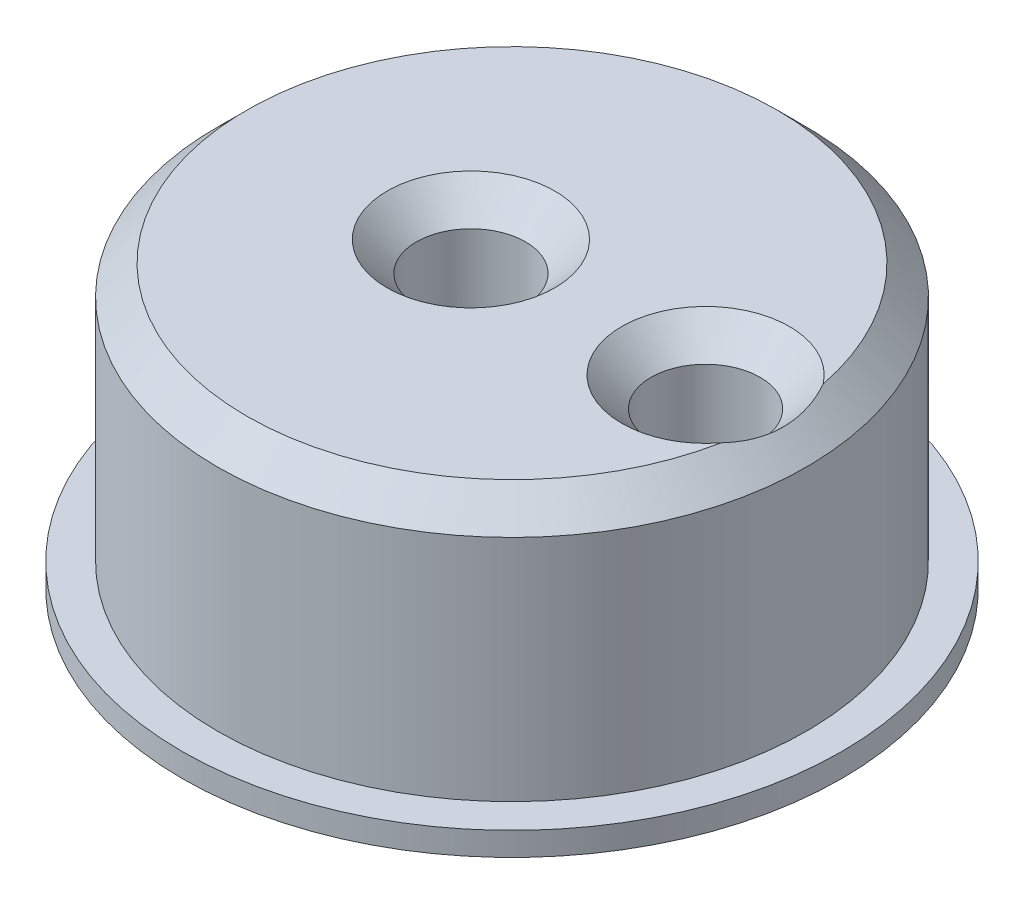
ISO-10303-21;
HEADER;
FILE_DESCRIPTION(('STEP AP214'),'2;1');
FILE_NAME('part.step','',(''),(''),'','','');
FILE_SCHEMA(('AUTOMOTIVE_DESIGN { 1 0 10303 214 1 1 1 1 }'));
ENDSEC;
DATA;
#1=APPLICATION_CONTEXT('core data for automotive mechanical design processes');
#2=APPLICATION_PROTOCOL_DEFINITION('international standard','automotive_design',2000,#1);
#3=PRODUCT_CONTEXT('',#1,'mechanical');
#4=PRODUCT('Part','Part','',(#3));
#5=PRODUCT_RELATED_PRODUCT_CATEGORY('part','',(#4));
#6=PRODUCT_DEFINITION_FORMATION('','',#4);
#7=PRODUCT_DEFINITION_CONTEXT('part definition',#1,'design');
#8=PRODUCT_DEFINITION('design','',#6,#7);
#9=PRODUCT_DEFINITION_SHAPE('','',#8);
#10=(LENGTH_UNIT() NAMED_UNIT(*) SI_UNIT(.MILLI.,.METRE.));
#11=(NAMED_UNIT(*) PLANE_ANGLE_UNIT() SI_UNIT($,.RADIAN.));
#12=(NAMED_UNIT(*) SI_UNIT($,.STERADIAN.) SOLID_ANGLE_UNIT());
#13=UNCERTAINTY_MEASURE_WITH_UNIT(LENGTH_MEASURE(1.E-05),#10,'distance_accuracy_value','');
#14=(GEOMETRIC_REPRESENTATION_CONTEXT(3) GLOBAL_UNCERTAINTY_ASSIGNED_CONTEXT((#13)) GLOBAL_UNIT_ASSIGNED_CONTEXT((#10,
#11,#12)) REPRESENTATION_CONTEXT('',''));
#15=CARTESIAN_POINT('',(0.,0.,0.));
#16=DIRECTION('',(0.,0.,1.));
#17=DIRECTION('',(1.,0.,0.));
#18=AXIS2_PLACEMENT_3D('',#15,#16,#17);
#19=CARTESIAN_POINT('',(0.,4.4,0.));
#20=DIRECTION('',(0.,1.,0.));
#21=DIRECTION('',(0.,0.,1.));
#22=AXIS2_PLACEMENT_3D('',#19,#20,#21);
#23=PLANE('',#22);
#24=CARTESIAN_POINT('',(-0.7,4.4,0.));
#25=DIRECTION('',(0.,1.,0.));
#26=DIRECTION('',(0.,0.,1.));
#27=AXIS2_PLACEMENT_3D('',#24,#25,#26);
#28=CIRCLE('',#27,1.43000000000001);
#29=CARTESIAN_POINT('',(-0.7,4.4,1.43000000000001));
#30=VERTEX_POINT('',#29);
#31=EDGE_CURVE('E52',#30,#30,#28,.F.);
#32=ORIENTED_EDGE('',*,*,#31,.T.);
#33=EDGE_LOOP('',(#32));
#34=FACE_BOUND('',#33,.T.);
#35=CARTESIAN_POINT('',(3.3,4.4,0.));
#36=DIRECTION('',(0.,1.,0.));
#37=DIRECTION('',(0.,0.,1.));
#38=AXIS2_PLACEMENT_3D('',#35,#36,#37);
#39=CIRCLE('',#38,1.43000000000001);
#40=CARTESIAN_POINT('',(3.3,4.4,1.43000000000001));
#41=VERTEX_POINT('',#40);
#42=CARTESIAN_POINT('',(4.43568181818182,4.4,-0.868980326504148));
#43=VERTEX_POINT('',#42);
#44=EDGE_CURVE('E71',#41,#43,#39,.F.);
#45=ORIENTED_EDGE('',*,*,#44,.T.);
#46=CARTESIAN_POINT('',(0.,4.4,0.));
#47=DIRECTION('',(0.,1.,0.));
#48=DIRECTION('',(0.,0.,1.));
#49=AXIS2_PLACEMENT_3D('',#46,#47,#48);
#50=CIRCLE('',#49,4.52);
#51=CARTESIAN_POINT('',(0.,4.4,4.52));
#52=VERTEX_POINT('',#51);
#53=EDGE_CURVE('E84',#43,#52,#50,.T.);
#54=ORIENTED_EDGE('',*,*,#53,.T.);
#55=CARTESIAN_POINT('',(0.,4.4,0.));
#56=DIRECTION('',(0.,1.,0.));
#57=DIRECTION('',(0.,0.,1.));
#58=AXIS2_PLACEMENT_3D('',#55,#56,#57);
#59=CIRCLE('',#58,4.52);
#60=CARTESIAN_POINT('',(4.43568181818182,4.4,0.868980326504148));
#61=VERTEX_POINT('',#60);
#62=EDGE_CURVE('E59',#52,#61,#59,.T.);
#63=ORIENTED_EDGE('',*,*,#62,.T.);
#64=CARTESIAN_POINT('',(3.3,4.4,0.));
#65=DIRECTION('',(0.,1.,0.));
#66=DIRECTION('',(0.,0.,1.));
#67=AXIS2_PLACEMENT_3D('',#64,#65,#66);
#68=CIRCLE('',#67,1.43000000000001);
#69=EDGE_CURVE('E69',#61,#41,#68,.F.);
#70=ORIENTED_EDGE('',*,*,#69,.T.);
#71=EDGE_LOOP('',(#45,#54,#63,#70));
#72=FACE_BOUND('',#71,.T.);
#73=ADVANCED_FACE('F37',(#34,#72),#23,.T.);
#74=CARTESIAN_POINT('',(0.,4.4,0.));
#75=DIRECTION('',(0.,-1.,0.));
#76=DIRECTION('',(0.,0.,-1.));
#77=AXIS2_PLACEMENT_3D('',#74,#75,#76);
#78=CYLINDRICAL_SURFACE('',#77,5.02);
#79=CARTESIAN_POINT('',(0.,3.9,0.));
#80=DIRECTION('',(0.,1.,0.));
#81=DIRECTION('',(0.,0.,1.));
#82=AXIS2_PLACEMENT_3D('',#79,#80,#81);
#83=CIRCLE('',#82,5.02);
#84=CARTESIAN_POINT('',(0.,3.9,5.02));
#85=VERTEX_POINT('',#84);
#86=EDGE_CURVE('E11',#85,#85,#83,.F.);
#87=ORIENTED_EDGE('',*,*,#86,.T.);
#88=EDGE_LOOP('',(#87));
#89=FACE_BOUND('',#88,.T.);
#90=CARTESIAN_POINT('',(0.,0.,0.));
#91=DIRECTION('',(0.,1.,0.));
#92=DIRECTION('',(0.,0.,1.));
#93=AXIS2_PLACEMENT_3D('',#90,#91,#92);
#94=CIRCLE('',#93,5.02);
#95=CARTESIAN_POINT('',(0.,0.,5.02));
#96=VERTEX_POINT('',#95);
#97=EDGE_CURVE('E111',#96,#96,#94,.T.);
#98=ORIENTED_EDGE('',*,*,#97,.T.);
#99=EDGE_LOOP('',(#98));
#100=FACE_BOUND('',#99,.T.);
#101=ADVANCED_FACE('F142',(#89,#100),#78,.T.);
#102=CARTESIAN_POINT('',(3.3,4.4,0.));
#103=DIRECTION('',(0.,-1.,0.));
#104=DIRECTION('',(0.,0.,-1.));
#105=AXIS2_PLACEMENT_3D('',#102,#103,#104);
#106=CYLINDRICAL_SURFACE('',#105,0.930000000000002);
#107=CARTESIAN_POINT('',(3.3,0.1,0.));
#108=DIRECTION('',(0.,-1.,0.));
#109=DIRECTION('',(0.,0.,-1.));
#110=AXIS2_PLACEMENT_3D('',#107,#108,#109);
#111=CIRCLE('',#110,0.930000000000002);
#112=CARTESIAN_POINT('',(3.3,0.1,-0.930000000000002));
#113=VERTEX_POINT('',#112);
#114=EDGE_CURVE('E105',#113,#113,#111,.T.);
#115=ORIENTED_EDGE('',*,*,#114,.T.);
#116=EDGE_LOOP('',(#115));
#117=FACE_BOUND('',#116,.T.);
#118=CARTESIAN_POINT('',(3.3,3.9,0.));
#119=DIRECTION('',(0.,1.,0.));
#120=DIRECTION('',(0.,0.,1.));
#121=AXIS2_PLACEMENT_3D('',#118,#119,#120);
#122=CIRCLE('',#121,0.930000000000002);
#123=CARTESIAN_POINT('',(3.3,3.9,0.930000000000002));
#124=VERTEX_POINT('',#123);
#125=EDGE_CURVE('E108',#124,#124,#122,.T.);
#126=ORIENTED_EDGE('',*,*,#125,.T.);
#127=EDGE_LOOP('',(#126));
#128=FACE_BOUND('',#127,.T.);
#129=ADVANCED_FACE('F147',(#117,#128),#106,.F.);
#130=CARTESIAN_POINT('',(-0.7,4.4,0.));
#131=DIRECTION('',(0.,-1.,0.));
#132=DIRECTION('',(0.,0.,-1.));
#133=AXIS2_PLACEMENT_3D('',#130,#131,#132);
#134=CYLINDRICAL_SURFACE('',#133,0.93);
#135=CARTESIAN_POINT('',(-0.7,0.100000000000002,0.));
#136=DIRECTION('',(0.,-1.,0.));
#137=DIRECTION('',(0.,0.,-1.));
#138=AXIS2_PLACEMENT_3D('',#135,#136,#137);
#139=CIRCLE('',#138,0.93);
#140=CARTESIAN_POINT('',(-0.7,0.100000000000002,-0.93));
#141=VERTEX_POINT('',#140);
#142=EDGE_CURVE('E76',#141,#141,#139,.T.);
#143=ORIENTED_EDGE('',*,*,#142,.T.);
#144=EDGE_LOOP('',(#143));
#145=FACE_BOUND('',#144,.T.);
#146=CARTESIAN_POINT('',(-0.7,3.9,0.));
#147=DIRECTION('',(0.,1.,0.));
#148=DIRECTION('',(0.,0.,1.));
#149=AXIS2_PLACEMENT_3D('',#146,#147,#148);
#150=CIRCLE('',#149,0.93);
#151=CARTESIAN_POINT('',(-0.7,3.9,0.930000000000001));
#152=VERTEX_POINT('',#151);
#153=EDGE_CURVE('E79',#152,#152,#150,.T.);
#154=ORIENTED_EDGE('',*,*,#153,.T.);
#155=EDGE_LOOP('',(#154));
#156=FACE_BOUND('',#155,.T.);
#157=ADVANCED_FACE('F137',(#145,#156),#134,.F.);
#158=CARTESIAN_POINT('',(0.,-0.4,0.));
#159=DIRECTION('',(0.,-1.,0.));
#160=DIRECTION('',(0.,0.,-1.));
#161=AXIS2_PLACEMENT_3D('',#158,#159,#160);
#162=PLANE('',#161);
#163=CARTESIAN_POINT('',(3.3,-0.4,0.));
#164=DIRECTION('',(0.,-1.,0.));
#165=DIRECTION('',(0.,0.,-1.));
#166=AXIS2_PLACEMENT_3D('',#163,#164,#165);
#167=CIRCLE('',#166,1.43);
#168=CARTESIAN_POINT('',(3.3,-0.4,-1.43));
#169=VERTEX_POINT('',#168);
#170=EDGE_CURVE('E98',#169,#169,#167,.F.);
#171=ORIENTED_EDGE('',*,*,#170,.T.);
#172=EDGE_LOOP('',(#171));
#173=FACE_BOUND('',#172,.T.);
#174=CARTESIAN_POINT('',(-0.7,-0.4,0.));
#175=DIRECTION('',(0.,-1.,0.));
#176=DIRECTION('',(0.,0.,-1.));
#177=AXIS2_PLACEMENT_3D('',#174,#175,#176);
#178=CIRCLE('',#177,1.43);
#179=CARTESIAN_POINT('',(-0.7,-0.4,-1.43));
#180=VERTEX_POINT('',#179);
#181=EDGE_CURVE('E100',#180,#180,#178,.F.);
#182=ORIENTED_EDGE('',*,*,#181,.T.);
#183=EDGE_LOOP('',(#182));
#184=FACE_BOUND('',#183,.T.);
#185=CARTESIAN_POINT('',(0.,-0.4,0.));
#186=DIRECTION('',(0.,-1.,0.));
#187=DIRECTION('',(0.,0.,-1.));
#188=AXIS2_PLACEMENT_3D('',#185,#186,#187);
#189=CIRCLE('',#188,5.62);
#190=CARTESIAN_POINT('',(0.,-0.4,-5.62));
#191=VERTEX_POINT('',#190);
#192=EDGE_CURVE('E114',#191,#191,#189,.T.);
#193=ORIENTED_EDGE('',*,*,#192,.T.);
#194=EDGE_LOOP('',(#193));
#195=FACE_BOUND('',#194,.T.);
#196=ADVANCED_FACE('F121',(#173,#184,#195),#162,.T.);
#197=CARTESIAN_POINT('',(0.,0.,0.));
#198=DIRECTION('',(0.,-1.,0.));
#199=DIRECTION('',(0.,0.,-1.));
#200=AXIS2_PLACEMENT_3D('',#197,#198,#199);
#201=PLANE('',#200);
#202=ORIENTED_EDGE('',*,*,#97,.F.);
#203=EDGE_LOOP('',(#202));
#204=FACE_BOUND('',#203,.T.);
#205=CARTESIAN_POINT('',(0.,0.,0.));
#206=DIRECTION('',(0.,-1.,0.));
#207=DIRECTION('',(0.,0.,-1.));
#208=AXIS2_PLACEMENT_3D('',#205,#206,#207);
#209=CIRCLE('',#208,5.62);
#210=CARTESIAN_POINT('',(0.,0.,-5.62));
#211=VERTEX_POINT('',#210);
#212=EDGE_CURVE('E115',#211,#211,#209,.T.);
#213=ORIENTED_EDGE('',*,*,#212,.F.);
#214=EDGE_LOOP('',(#213));
#215=FACE_BOUND('',#214,.T.);
#216=ADVANCED_FACE('F127',(#204,#215),#201,.F.);
#217=CARTESIAN_POINT('',(0.,-0.4,0.));
#218=DIRECTION('',(0.,1.,0.));
#219=DIRECTION('',(0.,0.,1.));
#220=AXIS2_PLACEMENT_3D('',#217,#218,#219);
#221=CYLINDRICAL_SURFACE('',#220,5.62);
#222=ORIENTED_EDGE('',*,*,#192,.F.);
#223=EDGE_LOOP('',(#222));
#224=FACE_BOUND('',#223,.T.);
#225=ORIENTED_EDGE('',*,*,#212,.T.);
#226=EDGE_LOOP('',(#225));
#227=FACE_BOUND('',#226,.T.);
#228=ADVANCED_FACE('F123',(#224,#227),#221,.T.);
#229=CARTESIAN_POINT('',(3.3,0.1,0.));
#230=DIRECTION('',(0.,-1.,0.));
#231=DIRECTION('',(0.,0.,-1.));
#232=AXIS2_PLACEMENT_3D('',#229,#230,#231);
#233=CONICAL_SURFACE('',#232,0.930000000000002,0.785398163397449);
#234=ORIENTED_EDGE('',*,*,#170,.F.);
#235=EDGE_LOOP('',(#234));
#236=FACE_BOUND('',#235,.T.);
#237=ORIENTED_EDGE('',*,*,#114,.F.);
#238=EDGE_LOOP('',(#237));
#239=FACE_BOUND('',#238,.T.);
#240=ADVANCED_FACE('F126',(#236,#239),#233,.F.);
#241=CARTESIAN_POINT('',(-0.7,0.100000000000002,0.));
#242=DIRECTION('',(0.,-1.,0.));
#243=DIRECTION('',(0.,0.,-1.));
#244=AXIS2_PLACEMENT_3D('',#241,#242,#243);
#245=CONICAL_SURFACE('',#244,0.93,0.785398163397448);
#246=ORIENTED_EDGE('',*,*,#181,.F.);
#247=EDGE_LOOP('',(#246));
#248=FACE_BOUND('',#247,.T.);
#249=ORIENTED_EDGE('',*,*,#142,.F.);
#250=EDGE_LOOP('',(#249));
#251=FACE_BOUND('',#250,.T.);
#252=ADVANCED_FACE('F93',(#248,#251),#245,.F.);
#253=CARTESIAN_POINT('',(-0.7,3.9,0.));
#254=DIRECTION('',(0.,1.,0.));
#255=DIRECTION('',(0.,0.,1.));
#256=AXIS2_PLACEMENT_3D('',#253,#254,#255);
#257=CONICAL_SURFACE('',#256,0.93,0.78539816339745);
#258=ORIENTED_EDGE('',*,*,#31,.F.);
#259=EDGE_LOOP('',(#258));
#260=FACE_BOUND('',#259,.T.);
#261=ORIENTED_EDGE('',*,*,#153,.F.);
#262=EDGE_LOOP('',(#261));
#263=FACE_BOUND('',#262,.T.);
#264=ADVANCED_FACE('F90',(#260,#263),#257,.F.);
#265=CARTESIAN_POINT('',(3.3,3.9,0.));
#266=DIRECTION('',(0.,1.,0.));
#267=DIRECTION('',(0.,0.,1.));
#268=AXIS2_PLACEMENT_3D('',#265,#266,#267);
#269=CONICAL_SURFACE('',#268,0.930000000000002,0.78539816339745);
#270=ORIENTED_EDGE('',*,*,#125,.F.);
#271=EDGE_LOOP('',(#270));
#272=FACE_BOUND('',#271,.T.);
#273=CARTESIAN_POINT('',(4.43532121212121,4.4002,-0.8697803086456));
#274=CARTESIAN_POINT('',(4.45774347325075,4.38776412413458,-0.820084857761405));
#275=CARTESIAN_POINT('',(4.47842609060243,4.37629309266614,-0.769345092409477));
#276=CARTESIAN_POINT('',(4.51603207682698,4.35543599103895,-0.666036860501678));
#277=CARTESIAN_POINT('',(4.53295281328495,4.34605138087499,-0.613467142983447));
#278=CARTESIAN_POINT('',(4.56269129751347,4.32955776775784,-0.506942560419511));
#279=CARTESIAN_POINT('',(4.57551770022107,4.32244396458737,-0.452990881183548));
#280=CARTESIAN_POINT('',(4.59688127230878,4.31059526073689,-0.344018398168748));
#281=CARTESIAN_POINT('',(4.60541968343436,4.30585967135771,-0.288997908702622));
#282=CARTESIAN_POINT('',(4.62404259742138,4.29553099641711,-0.125370359791001));
#283=CARTESIAN_POINT('',(4.62782788724165,4.29343159212342,-0.0157280341275598));
#284=CARTESIAN_POINT('',(4.61794029609332,4.29891546621365,0.202424646670329));
#285=CARTESIAN_POINT('',(4.60427568209315,4.30649415955639,0.310935513291654));
#286=CARTESIAN_POINT('',(4.56630764658799,4.32755206152292,0.495764104338654));
#287=CARTESIAN_POINT('',(4.54569685350497,4.33898325770328,0.573112870673131));
#288=CARTESIAN_POINT('',(4.49637608846955,4.36633763162176,0.724299675044293));
#289=CARTESIAN_POINT('',(4.46767247240513,4.38225728424555,0.79814041522429));
#290=CARTESIAN_POINT('',(4.43532121212121,4.4002,0.8697803086456));
#291=B_SPLINE_CURVE_WITH_KNOTS('',3,(#273,#274,#275,#276,#277,#278,#279,#280,#281,#282,#283,
#284,#285,#286,#287,#288,#289,#290),.UNSPECIFIED.,.F.,.F.,(4,2,2,2,2,2,2,2,4),(0.,
0.167738289979589,0.335593589676109,0.503091676608826,0.670541230307703,0.99777444741739,
1.32485269385374,1.56683879609971,1.80863537577154),.UNSPECIFIED.);
#292=EDGE_CURVE('E42',#43,#61,#291,.T.);
#293=ORIENTED_EDGE('',*,*,#292,.F.);
#294=ORIENTED_EDGE('',*,*,#44,.F.);
#295=ORIENTED_EDGE('',*,*,#69,.F.);
#296=EDGE_LOOP('',(#293,#294,#295));
#297=FACE_BOUND('',#296,.T.);
#298=ADVANCED_FACE('F75',(#272,#297),#269,.F.);
#299=CARTESIAN_POINT('',(0.,4.4,0.));
#300=DIRECTION('',(0.,-1.,0.));
#301=DIRECTION('',(0.,0.,-1.));
#302=AXIS2_PLACEMENT_3D('',#299,#300,#301);
#303=CONICAL_SURFACE('',#302,4.52,0.785398163397448);
#304=ORIENTED_EDGE('',*,*,#86,.F.);
#305=EDGE_LOOP('',(#304));
#306=FACE_BOUND('',#305,.T.);
#307=ORIENTED_EDGE('',*,*,#53,.F.);
#308=ORIENTED_EDGE('',*,*,#292,.T.);
#309=ORIENTED_EDGE('',*,*,#62,.F.);
#310=EDGE_LOOP('',(#307,#308,#309));
#311=FACE_BOUND('',#310,.T.);
#312=ADVANCED_FACE('F40',(#306,#311),#303,.T.);
#313=CLOSED_SHELL('',(#73,#101,#129,#157,#196,#216,#228,#240,#252,#264,#298,#312));
#314=MANIFOLD_SOLID_BREP('B2',#313);
#315=ADVANCED_BREP_SHAPE_REPRESENTATION('',(#18,#314),#14);
#316=SHAPE_DEFINITION_REPRESENTATION(#9,#315);
ENDSEC;
END-ISO-10303-21;
